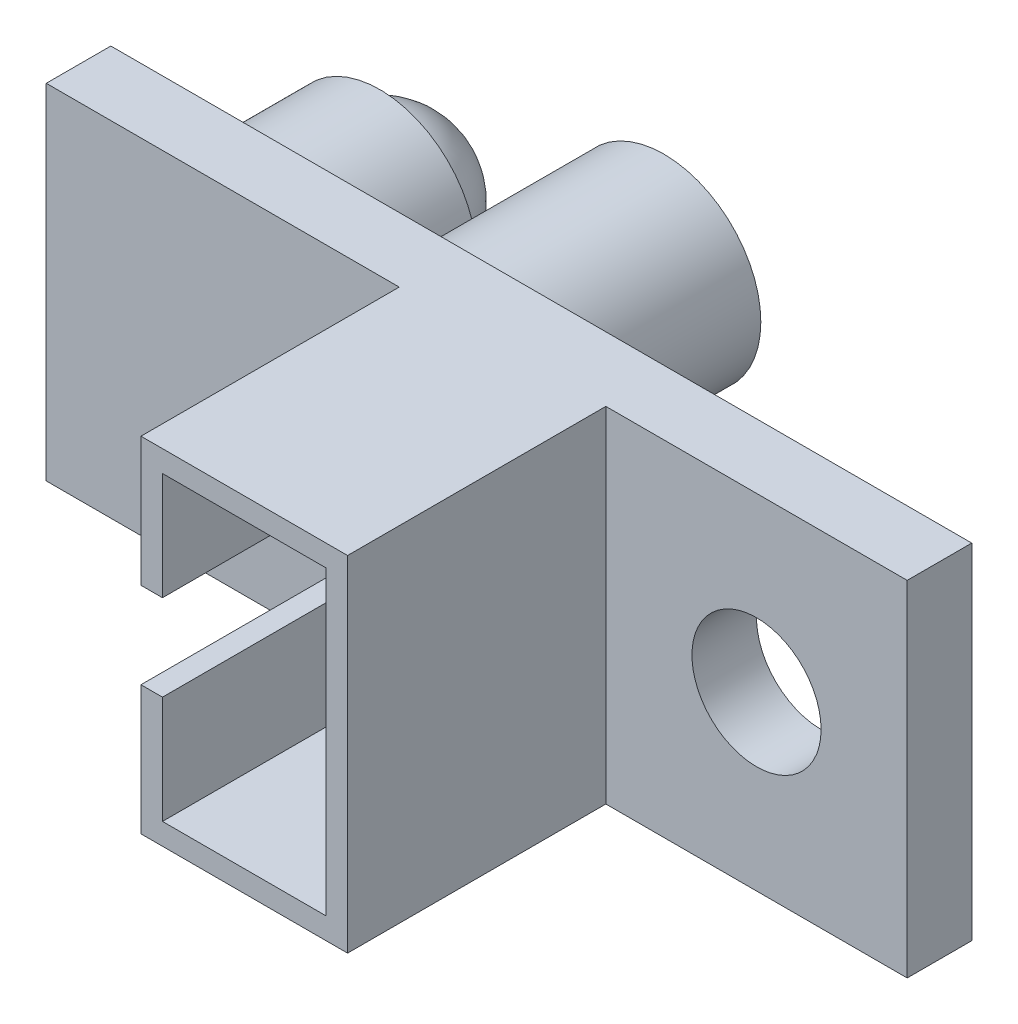
ISO-10303-21;
HEADER;
FILE_DESCRIPTION(('STEP AP214'),'2;1');
FILE_NAME('part.step','',(''),(''),'','','');
FILE_SCHEMA(('AUTOMOTIVE_DESIGN { 1 0 10303 214 1 1 1 1 }'));
ENDSEC;
DATA;
#1=APPLICATION_CONTEXT('core data for automotive mechanical design processes');
#2=APPLICATION_PROTOCOL_DEFINITION('international standard','automotive_design',2000,#1);
#3=PRODUCT_CONTEXT('',#1,'mechanical');
#4=PRODUCT('Part','Part','',(#3));
#5=PRODUCT_RELATED_PRODUCT_CATEGORY('part','',(#4));
#6=PRODUCT_DEFINITION_FORMATION('','',#4);
#7=PRODUCT_DEFINITION_CONTEXT('part definition',#1,'design');
#8=PRODUCT_DEFINITION('design','',#6,#7);
#9=PRODUCT_DEFINITION_SHAPE('','',#8);
#10=(LENGTH_UNIT() NAMED_UNIT(*) SI_UNIT(.MILLI.,.METRE.));
#11=(NAMED_UNIT(*) PLANE_ANGLE_UNIT() SI_UNIT($,.RADIAN.));
#12=(NAMED_UNIT(*) SI_UNIT($,.STERADIAN.) SOLID_ANGLE_UNIT());
#13=UNCERTAINTY_MEASURE_WITH_UNIT(LENGTH_MEASURE(1.E-05),#10,'distance_accuracy_value','');
#14=(GEOMETRIC_REPRESENTATION_CONTEXT(3) GLOBAL_UNCERTAINTY_ASSIGNED_CONTEXT((#13)) GLOBAL_UNIT_ASSIGNED_CONTEXT((#10,
#11,#12)) REPRESENTATION_CONTEXT('',''));
#15=CARTESIAN_POINT('',(0.,0.,0.));
#16=DIRECTION('',(0.,0.,1.));
#17=DIRECTION('',(1.,0.,0.));
#18=AXIS2_PLACEMENT_3D('',#15,#16,#17);
#19=CARTESIAN_POINT('',(-3.15,0.,-4.));
#20=DIRECTION('',(0.,0.,1.));
#21=DIRECTION('',(1.,0.,0.));
#22=AXIS2_PLACEMENT_3D('',#19,#20,#21);
#23=CYLINDRICAL_SURFACE('',#22,1.75);
#24=CARTESIAN_POINT('',(-3.15,0.,-6.));
#25=DIRECTION('',(0.,0.,-1.));
#26=DIRECTION('',(-1.,0.,0.));
#27=AXIS2_PLACEMENT_3D('',#24,#25,#26);
#28=CIRCLE('',#27,1.75);
#29=CARTESIAN_POINT('',(-4.9,0.,-6.));
#30=VERTEX_POINT('',#29);
#31=EDGE_CURVE('E344',#30,#30,#28,.T.);
#32=ORIENTED_EDGE('',*,*,#31,.T.);
#33=EDGE_LOOP('',(#32));
#34=FACE_BOUND('',#33,.T.);
#35=CARTESIAN_POINT('',(-3.15,0.,-4.));
#36=DIRECTION('',(0.,0.,1.));
#37=DIRECTION('',(1.,0.,0.));
#38=AXIS2_PLACEMENT_3D('',#35,#36,#37);
#39=CIRCLE('',#38,1.75);
#40=CARTESIAN_POINT('',(-1.4,0.,-4.));
#41=VERTEX_POINT('',#40);
#42=EDGE_CURVE('E12',#41,#41,#39,.F.);
#43=ORIENTED_EDGE('',*,*,#42,.F.);
#44=EDGE_LOOP('',(#43));
#45=FACE_BOUND('',#44,.T.);
#46=ADVANCED_FACE('F40',(#34,#45),#23,.F.);
#47=CARTESIAN_POINT('',(0.,0.,1.5));
#48=DIRECTION('',(0.,0.,1.));
#49=DIRECTION('',(1.,0.,0.));
#50=AXIS2_PLACEMENT_3D('',#47,#48,#49);
#51=PLANE('',#50);
#52=DIRECTION('',(0.,-1.,0.));
#53=VECTOR('',#52,1.);
#54=CARTESIAN_POINT('',(-1.8,4.,1.5));
#55=LINE('',#54,#53);
#56=CARTESIAN_POINT('',(-1.8,4.,1.5));
#57=VERTEX_POINT('',#56);
#58=CARTESIAN_POINT('',(-1.8,-4.,1.5));
#59=VERTEX_POINT('',#58);
#60=EDGE_CURVE('E233',#57,#59,#55,.T.);
#61=ORIENTED_EDGE('',*,*,#60,.F.);
#62=DIRECTION('',(-1.,0.,0.));
#63=VECTOR('',#62,1.);
#64=CARTESIAN_POINT('',(-10.,4.,1.5));
#65=LINE('',#64,#63);
#66=CARTESIAN_POINT('',(-10.,4.,1.5));
#67=VERTEX_POINT('',#66);
#68=EDGE_CURVE('E197',#57,#67,#65,.T.);
#69=ORIENTED_EDGE('',*,*,#68,.T.);
#70=DIRECTION('',(0.,-1.,0.));
#71=VECTOR('',#70,1.);
#72=CARTESIAN_POINT('',(-10.,4.,1.5));
#73=LINE('',#72,#71);
#74=CARTESIAN_POINT('',(-10.,-4.,1.5));
#75=VERTEX_POINT('',#74);
#76=EDGE_CURVE('E196',#67,#75,#73,.T.);
#77=ORIENTED_EDGE('',*,*,#76,.T.);
#78=DIRECTION('',(1.,0.,0.));
#79=VECTOR('',#78,1.);
#80=CARTESIAN_POINT('',(-10.,-4.,1.5));
#81=LINE('',#80,#79);
#82=EDGE_CURVE('E186',#75,#59,#81,.T.);
#83=ORIENTED_EDGE('',*,*,#82,.T.);
#84=EDGE_LOOP('',(#61,#69,#77,#83));
#85=FACE_BOUND('',#84,.T.);
#86=ADVANCED_FACE('F231',(#85),#51,.T.);
#87=CARTESIAN_POINT('',(10.,4.,1.5));
#88=DIRECTION('',(-1.,0.,0.));
#89=DIRECTION('',(0.,0.,1.));
#90=AXIS2_PLACEMENT_3D('',#87,#88,#89);
#91=PLANE('',#90);
#92=DIRECTION('',(0.,1.,0.));
#93=VECTOR('',#92,1.);
#94=CARTESIAN_POINT('',(10.,4.,0.));
#95=LINE('',#94,#93);
#96=CARTESIAN_POINT('',(10.,-4.,0.));
#97=VERTEX_POINT('',#96);
#98=CARTESIAN_POINT('',(10.,4.,0.));
#99=VERTEX_POINT('',#98);
#100=EDGE_CURVE('E176',#97,#99,#95,.T.);
#101=ORIENTED_EDGE('',*,*,#100,.T.);
#102=DIRECTION('',(0.,0.,-1.));
#103=VECTOR('',#102,1.);
#104=CARTESIAN_POINT('',(10.,4.,1.5));
#105=LINE('',#104,#103);
#106=CARTESIAN_POINT('',(10.,4.,1.5));
#107=VERTEX_POINT('',#106);
#108=EDGE_CURVE('E189',#107,#99,#105,.T.);
#109=ORIENTED_EDGE('',*,*,#108,.F.);
#110=DIRECTION('',(0.,1.,0.));
#111=VECTOR('',#110,1.);
#112=CARTESIAN_POINT('',(10.,4.,1.5));
#113=LINE('',#112,#111);
#114=CARTESIAN_POINT('',(10.,-4.,1.5));
#115=VERTEX_POINT('',#114);
#116=EDGE_CURVE('E181',#115,#107,#113,.T.);
#117=ORIENTED_EDGE('',*,*,#116,.F.);
#118=DIRECTION('',(0.,0.,-1.));
#119=VECTOR('',#118,1.);
#120=CARTESIAN_POINT('',(10.,-4.,1.5));
#121=LINE('',#120,#119);
#122=EDGE_CURVE('E182',#115,#97,#121,.T.);
#123=ORIENTED_EDGE('',*,*,#122,.T.);
#124=EDGE_LOOP('',(#101,#109,#117,#123));
#125=FACE_BOUND('',#124,.T.);
#126=ADVANCED_FACE('F229',(#125),#91,.F.);
#127=CARTESIAN_POINT('',(-10.,4.,1.5));
#128=DIRECTION('',(0.,-1.,0.));
#129=DIRECTION('',(0.,0.,-1.));
#130=AXIS2_PLACEMENT_3D('',#127,#128,#129);
#131=PLANE('',#130);
#132=DIRECTION('',(-1.,0.,0.));
#133=VECTOR('',#132,1.);
#134=CARTESIAN_POINT('',(-10.,4.,0.));
#135=LINE('',#134,#133);
#136=CARTESIAN_POINT('',(-10.,4.,0.));
#137=VERTEX_POINT('',#136);
#138=EDGE_CURVE('E175',#99,#137,#135,.T.);
#139=ORIENTED_EDGE('',*,*,#138,.T.);
#140=DIRECTION('',(0.,0.,-1.));
#141=VECTOR('',#140,1.);
#142=CARTESIAN_POINT('',(-10.,4.,1.5));
#143=LINE('',#142,#141);
#144=EDGE_CURVE('E165',#67,#137,#143,.T.);
#145=ORIENTED_EDGE('',*,*,#144,.F.);
#146=ORIENTED_EDGE('',*,*,#68,.F.);
#147=DIRECTION('',(0.,0.,-1.));
#148=VECTOR('',#147,1.);
#149=CARTESIAN_POINT('',(-1.8,4.,7.5));
#150=LINE('',#149,#148);
#151=CARTESIAN_POINT('',(-1.8,4.,7.5));
#152=VERTEX_POINT('',#151);
#153=EDGE_CURVE('E249',#152,#57,#150,.T.);
#154=ORIENTED_EDGE('',*,*,#153,.F.);
#155=DIRECTION('',(-1.,0.,0.));
#156=VECTOR('',#155,1.);
#157=CARTESIAN_POINT('',(-1.8,4.,7.5));
#158=LINE('',#157,#156);
#159=CARTESIAN_POINT('',(3.,4.,7.5));
#160=VERTEX_POINT('',#159);
#161=EDGE_CURVE('E264',#160,#152,#158,.T.);
#162=ORIENTED_EDGE('',*,*,#161,.F.);
#163=DIRECTION('',(0.,0.,-1.));
#164=VECTOR('',#163,1.);
#165=CARTESIAN_POINT('',(3.,4.,7.5));
#166=LINE('',#165,#164);
#167=CARTESIAN_POINT('',(3.,4.,1.5));
#168=VERTEX_POINT('',#167);
#169=EDGE_CURVE('E270',#160,#168,#166,.T.);
#170=ORIENTED_EDGE('',*,*,#169,.T.);
#171=EDGE_CURVE('E193',#107,#168,#65,.T.);
#172=ORIENTED_EDGE('',*,*,#171,.F.);
#173=ORIENTED_EDGE('',*,*,#108,.T.);
#174=EDGE_LOOP('',(#139,#145,#146,#154,#162,#170,#172,#173));
#175=FACE_BOUND('',#174,.T.);
#176=ADVANCED_FACE('F237',(#175),#131,.F.);
#177=CARTESIAN_POINT('',(-10.,4.,1.5));
#178=DIRECTION('',(1.,0.,0.));
#179=DIRECTION('',(0.,1.,0.));
#180=AXIS2_PLACEMENT_3D('',#177,#178,#179);
#181=PLANE('',#180);
#182=DIRECTION('',(0.,-1.,0.));
#183=VECTOR('',#182,1.);
#184=CARTESIAN_POINT('',(-10.,4.,0.));
#185=LINE('',#184,#183);
#186=CARTESIAN_POINT('',(-10.,0.,0.));
#187=VERTEX_POINT('',#186);
#188=EDGE_CURVE('E157',#137,#187,#185,.T.);
#189=ORIENTED_EDGE('',*,*,#188,.T.);
#190=CARTESIAN_POINT('',(-10.,-4.,0.));
#191=VERTEX_POINT('',#190);
#192=EDGE_CURVE('E161',#187,#191,#185,.T.);
#193=ORIENTED_EDGE('',*,*,#192,.T.);
#194=DIRECTION('',(0.,0.,-1.));
#195=VECTOR('',#194,1.);
#196=CARTESIAN_POINT('',(-10.,-4.,1.5));
#197=LINE('',#196,#195);
#198=EDGE_CURVE('E185',#75,#191,#197,.T.);
#199=ORIENTED_EDGE('',*,*,#198,.F.);
#200=ORIENTED_EDGE('',*,*,#76,.F.);
#201=ORIENTED_EDGE('',*,*,#144,.T.);
#202=EDGE_LOOP('',(#189,#193,#199,#200,#201));
#203=FACE_BOUND('',#202,.T.);
#204=ADVANCED_FACE('F159',(#203),#181,.F.);
#205=CARTESIAN_POINT('',(-10.,-4.,1.5));
#206=DIRECTION('',(0.,1.,0.));
#207=DIRECTION('',(0.,0.,1.));
#208=AXIS2_PLACEMENT_3D('',#205,#206,#207);
#209=PLANE('',#208);
#210=DIRECTION('',(1.,0.,0.));
#211=VECTOR('',#210,1.);
#212=CARTESIAN_POINT('',(-10.,-4.,0.));
#213=LINE('',#212,#211);
#214=EDGE_CURVE('E168',#191,#97,#213,.T.);
#215=ORIENTED_EDGE('',*,*,#214,.T.);
#216=ORIENTED_EDGE('',*,*,#122,.F.);
#217=CARTESIAN_POINT('',(3.,-4.,1.5));
#218=VERTEX_POINT('',#217);
#219=EDGE_CURVE('E205',#218,#115,#81,.T.);
#220=ORIENTED_EDGE('',*,*,#219,.F.);
#221=DIRECTION('',(0.,0.,-1.));
#222=VECTOR('',#221,1.);
#223=CARTESIAN_POINT('',(3.,-4.,7.5));
#224=LINE('',#223,#222);
#225=CARTESIAN_POINT('',(3.,-4.,7.5));
#226=VERTEX_POINT('',#225);
#227=EDGE_CURVE('E245',#226,#218,#224,.T.);
#228=ORIENTED_EDGE('',*,*,#227,.F.);
#229=DIRECTION('',(1.,0.,0.));
#230=VECTOR('',#229,1.);
#231=CARTESIAN_POINT('',(-1.8,-4.,7.5));
#232=LINE('',#231,#230);
#233=CARTESIAN_POINT('',(-1.8,-4.,7.5));
#234=VERTEX_POINT('',#233);
#235=EDGE_CURVE('E241',#234,#226,#232,.T.);
#236=ORIENTED_EDGE('',*,*,#235,.F.);
#237=DIRECTION('',(0.,0.,-1.));
#238=VECTOR('',#237,1.);
#239=CARTESIAN_POINT('',(-1.8,-4.,7.5));
#240=LINE('',#239,#238);
#241=EDGE_CURVE('E240',#234,#59,#240,.T.);
#242=ORIENTED_EDGE('',*,*,#241,.T.);
#243=ORIENTED_EDGE('',*,*,#82,.F.);
#244=ORIENTED_EDGE('',*,*,#198,.T.);
#245=EDGE_LOOP('',(#215,#216,#220,#228,#236,#242,#243,#244));
#246=FACE_BOUND('',#245,.T.);
#247=ADVANCED_FACE('F226',(#246),#209,.F.);
#248=DIRECTION('',(0.,1.,0.));
#249=VECTOR('',#248,1.);
#250=CARTESIAN_POINT('',(3.,4.,1.5));
#251=LINE('',#250,#249);
#252=EDGE_CURVE('E222',#218,#168,#251,.T.);
#253=ORIENTED_EDGE('',*,*,#252,.F.);
#254=ORIENTED_EDGE('',*,*,#219,.T.);
#255=ORIENTED_EDGE('',*,*,#116,.T.);
#256=ORIENTED_EDGE('',*,*,#171,.T.);
#257=EDGE_LOOP('',(#253,#254,#255,#256));
#258=FACE_BOUND('',#257,.T.);
#259=CARTESIAN_POINT('',(6.5,0.,1.5));
#260=DIRECTION('',(0.,0.,1.));
#261=DIRECTION('',(1.,0.,0.));
#262=AXIS2_PLACEMENT_3D('',#259,#260,#261);
#263=CIRCLE('',#262,1.5);
#264=CARTESIAN_POINT('',(8.,0.,1.5));
#265=VERTEX_POINT('',#264);
#266=EDGE_CURVE('E244',#265,#265,#263,.T.);
#267=ORIENTED_EDGE('',*,*,#266,.F.);
#268=EDGE_LOOP('',(#267));
#269=FACE_BOUND('',#268,.T.);
#270=ADVANCED_FACE('F217',(#258,#269),#51,.T.);
#271=CARTESIAN_POINT('',(0.,0.,0.));
#272=DIRECTION('',(0.,0.,1.));
#273=DIRECTION('',(1.,0.,0.));
#274=AXIS2_PLACEMENT_3D('',#271,#272,#273);
#275=PLANE('',#274);
#276=CARTESIAN_POINT('',(-3.15,0.,0.));
#277=DIRECTION('',(0.,0.,1.));
#278=DIRECTION('',(1.,0.,0.));
#279=AXIS2_PLACEMENT_3D('',#276,#277,#278);
#280=CIRCLE('',#279,2.25);
#281=CARTESIAN_POINT('',(-0.899999999999999,0.,0.));
#282=VERTEX_POINT('',#281);
#283=EDGE_CURVE('E48',#282,#282,#280,.F.);
#284=ORIENTED_EDGE('',*,*,#283,.F.);
#285=EDGE_LOOP('',(#284));
#286=FACE_BOUND('',#285,.T.);
#287=CARTESIAN_POINT('',(6.5,0.,0.));
#288=DIRECTION('',(0.,0.,1.));
#289=DIRECTION('',(1.,0.,0.));
#290=AXIS2_PLACEMENT_3D('',#287,#288,#289);
#291=CIRCLE('',#290,1.5);
#292=CARTESIAN_POINT('',(8.,0.,0.));
#293=VERTEX_POINT('',#292);
#294=EDGE_CURVE('E268',#293,#293,#291,.T.);
#295=ORIENTED_EDGE('',*,*,#294,.T.);
#296=EDGE_LOOP('',(#295));
#297=FACE_BOUND('',#296,.T.);
#298=ORIENTED_EDGE('',*,*,#192,.F.);
#299=CARTESIAN_POINT('',(-7.75,0.,0.));
#300=DIRECTION('',(0.,0.,-1.));
#301=DIRECTION('',(-1.,0.,0.));
#302=AXIS2_PLACEMENT_3D('',#299,#300,#301);
#303=CIRCLE('',#302,2.25);
#304=EDGE_CURVE('E173',#187,#187,#303,.T.);
#305=ORIENTED_EDGE('',*,*,#304,.F.);
#306=ORIENTED_EDGE('',*,*,#188,.F.);
#307=ORIENTED_EDGE('',*,*,#138,.F.);
#308=ORIENTED_EDGE('',*,*,#100,.F.);
#309=ORIENTED_EDGE('',*,*,#214,.F.);
#310=EDGE_LOOP('',(#298,#305,#306,#307,#308,#309));
#311=FACE_BOUND('',#310,.T.);
#312=ADVANCED_FACE('F171',(#286,#297,#311),#275,.F.);
#313=CARTESIAN_POINT('',(6.5,0.,0.));
#314=DIRECTION('',(0.,0.,1.));
#315=DIRECTION('',(1.,0.,0.));
#316=AXIS2_PLACEMENT_3D('',#313,#314,#315);
#317=CYLINDRICAL_SURFACE('',#316,1.5);
#318=ORIENTED_EDGE('',*,*,#294,.F.);
#319=EDGE_LOOP('',(#318));
#320=FACE_BOUND('',#319,.T.);
#321=ORIENTED_EDGE('',*,*,#266,.T.);
#322=EDGE_LOOP('',(#321));
#323=FACE_BOUND('',#322,.T.);
#324=ADVANCED_FACE('F412',(#320,#323),#317,.F.);
#325=CARTESIAN_POINT('',(0.,0.,7.5));
#326=DIRECTION('',(0.,0.,1.));
#327=DIRECTION('',(1.,0.,0.));
#328=AXIS2_PLACEMENT_3D('',#325,#326,#327);
#329=PLANE('',#328);
#330=DIRECTION('',(-1.,0.,0.));
#331=VECTOR('',#330,1.);
#332=CARTESIAN_POINT('',(-0.799999999999999,-1.,7.5));
#333=LINE('',#332,#331);
#334=CARTESIAN_POINT('',(-1.3,-1.,7.5));
#335=VERTEX_POINT('',#334);
#336=CARTESIAN_POINT('',(-1.8,-1.,7.5));
#337=VERTEX_POINT('',#336);
#338=EDGE_CURVE('E307',#335,#337,#333,.T.);
#339=ORIENTED_EDGE('',*,*,#338,.T.);
#340=DIRECTION('',(0.,-1.,0.));
#341=VECTOR('',#340,1.);
#342=CARTESIAN_POINT('',(-1.8,4.,7.5));
#343=LINE('',#342,#341);
#344=EDGE_CURVE('E252',#337,#234,#343,.T.);
#345=ORIENTED_EDGE('',*,*,#344,.T.);
#346=ORIENTED_EDGE('',*,*,#235,.T.);
#347=DIRECTION('',(0.,1.,0.));
#348=VECTOR('',#347,1.);
#349=CARTESIAN_POINT('',(3.,4.,7.5));
#350=LINE('',#349,#348);
#351=EDGE_CURVE('E281',#226,#160,#350,.T.);
#352=ORIENTED_EDGE('',*,*,#351,.T.);
#353=ORIENTED_EDGE('',*,*,#161,.T.);
#354=CARTESIAN_POINT('',(-1.8,1.,7.5));
#355=VERTEX_POINT('',#354);
#356=EDGE_CURVE('E284',#152,#355,#343,.T.);
#357=ORIENTED_EDGE('',*,*,#356,.T.);
#358=DIRECTION('',(-1.,0.,0.));
#359=VECTOR('',#358,1.);
#360=CARTESIAN_POINT('',(-0.799999999999999,1.,7.5));
#361=LINE('',#360,#359);
#362=CARTESIAN_POINT('',(-1.3,1.,7.5));
#363=VERTEX_POINT('',#362);
#364=EDGE_CURVE('E317',#363,#355,#361,.T.);
#365=ORIENTED_EDGE('',*,*,#364,.F.);
#366=DIRECTION('',(0.,-1.,0.));
#367=VECTOR('',#366,1.);
#368=CARTESIAN_POINT('',(-1.3,3.5,7.5));
#369=LINE('',#368,#367);
#370=CARTESIAN_POINT('',(-1.3,3.5,7.5));
#371=VERTEX_POINT('',#370);
#372=EDGE_CURVE('E314',#371,#363,#369,.T.);
#373=ORIENTED_EDGE('',*,*,#372,.F.);
#374=DIRECTION('',(-1.,0.,0.));
#375=VECTOR('',#374,1.);
#376=CARTESIAN_POINT('',(-1.3,3.5,7.5));
#377=LINE('',#376,#375);
#378=CARTESIAN_POINT('',(2.5,3.5,7.5));
#379=VERTEX_POINT('',#378);
#380=EDGE_CURVE('E293',#379,#371,#377,.T.);
#381=ORIENTED_EDGE('',*,*,#380,.F.);
#382=DIRECTION('',(0.,1.,0.));
#383=VECTOR('',#382,1.);
#384=CARTESIAN_POINT('',(2.5,3.5,7.5));
#385=LINE('',#384,#383);
#386=CARTESIAN_POINT('',(2.5,-3.5,7.5));
#387=VERTEX_POINT('',#386);
#388=EDGE_CURVE('E309',#387,#379,#385,.T.);
#389=ORIENTED_EDGE('',*,*,#388,.F.);
#390=DIRECTION('',(1.,0.,0.));
#391=VECTOR('',#390,1.);
#392=CARTESIAN_POINT('',(-1.3,-3.5,7.5));
#393=LINE('',#392,#391);
#394=CARTESIAN_POINT('',(-1.3,-3.5,7.5));
#395=VERTEX_POINT('',#394);
#396=EDGE_CURVE('E312',#395,#387,#393,.T.);
#397=ORIENTED_EDGE('',*,*,#396,.F.);
#398=EDGE_CURVE('E297',#335,#395,#369,.T.);
#399=ORIENTED_EDGE('',*,*,#398,.F.);
#400=EDGE_LOOP('',(#339,#345,#346,#352,#353,#357,#365,#373,#381,#389,#397,#399));
#401=FACE_BOUND('',#400,.T.);
#402=ADVANCED_FACE('F409',(#401),#329,.T.);
#403=CARTESIAN_POINT('',(-1.8,4.,7.5));
#404=DIRECTION('',(1.,0.,0.));
#405=DIRECTION('',(0.,1.,0.));
#406=AXIS2_PLACEMENT_3D('',#403,#404,#405);
#407=PLANE('',#406);
#408=ORIENTED_EDGE('',*,*,#344,.F.);
#409=DIRECTION('',(0.,0.,1.));
#410=VECTOR('',#409,1.);
#411=CARTESIAN_POINT('',(-1.8,-1.,3.));
#412=LINE('',#411,#410);
#413=CARTESIAN_POINT('',(-1.8,-1.,3.));
#414=VERTEX_POINT('',#413);
#415=EDGE_CURVE('E319',#414,#337,#412,.T.);
#416=ORIENTED_EDGE('',*,*,#415,.F.);
#417=DIRECTION('',(0.,-1.,0.));
#418=VECTOR('',#417,1.);
#419=CARTESIAN_POINT('',(-1.8,1.,3.));
#420=LINE('',#419,#418);
#421=CARTESIAN_POINT('',(-1.8,1.,3.));
#422=VERTEX_POINT('',#421);
#423=EDGE_CURVE('E326',#422,#414,#420,.T.);
#424=ORIENTED_EDGE('',*,*,#423,.F.);
#425=DIRECTION('',(0.,0.,-1.));
#426=VECTOR('',#425,1.);
#427=CARTESIAN_POINT('',(-1.8,1.,3.));
#428=LINE('',#427,#426);
#429=EDGE_CURVE('E329',#355,#422,#428,.T.);
#430=ORIENTED_EDGE('',*,*,#429,.F.);
#431=ORIENTED_EDGE('',*,*,#356,.F.);
#432=ORIENTED_EDGE('',*,*,#153,.T.);
#433=ORIENTED_EDGE('',*,*,#60,.T.);
#434=ORIENTED_EDGE('',*,*,#241,.F.);
#435=EDGE_LOOP('',(#408,#416,#424,#430,#431,#432,#433,#434));
#436=FACE_BOUND('',#435,.T.);
#437=ADVANCED_FACE('F247',(#436),#407,.F.);
#438=CARTESIAN_POINT('',(3.,4.,7.5));
#439=DIRECTION('',(-1.,0.,0.));
#440=DIRECTION('',(0.,-1.,0.));
#441=AXIS2_PLACEMENT_3D('',#438,#439,#440);
#442=PLANE('',#441);
#443=ORIENTED_EDGE('',*,*,#252,.T.);
#444=ORIENTED_EDGE('',*,*,#169,.F.);
#445=ORIENTED_EDGE('',*,*,#351,.F.);
#446=ORIENTED_EDGE('',*,*,#227,.T.);
#447=EDGE_LOOP('',(#443,#444,#445,#446));
#448=FACE_BOUND('',#447,.T.);
#449=ADVANCED_FACE('F279',(#448),#442,.F.);
#450=CARTESIAN_POINT('',(-1.3,3.5,7.5));
#451=DIRECTION('',(1.,0.,0.));
#452=DIRECTION('',(0.,1.,0.));
#453=AXIS2_PLACEMENT_3D('',#450,#451,#452);
#454=PLANE('',#453);
#455=DIRECTION('',(0.,0.,-1.));
#456=VECTOR('',#455,1.);
#457=CARTESIAN_POINT('',(-1.3,-1.,7.5));
#458=LINE('',#457,#456);
#459=CARTESIAN_POINT('',(-1.3,-1.,3.));
#460=VERTEX_POINT('',#459);
#461=EDGE_CURVE('E622',#335,#460,#458,.T.);
#462=ORIENTED_EDGE('',*,*,#461,.F.);
#463=ORIENTED_EDGE('',*,*,#398,.T.);
#464=DIRECTION('',(0.,0.,-1.));
#465=VECTOR('',#464,1.);
#466=CARTESIAN_POINT('',(-1.3,-3.5,7.5));
#467=LINE('',#466,#465);
#468=CARTESIAN_POINT('',(-1.3,-3.5,1.5));
#469=VERTEX_POINT('',#468);
#470=EDGE_CURVE('E250',#395,#469,#467,.T.);
#471=ORIENTED_EDGE('',*,*,#470,.T.);
#472=DIRECTION('',(0.,-1.,0.));
#473=VECTOR('',#472,1.);
#474=CARTESIAN_POINT('',(-1.3,3.5,1.5));
#475=LINE('',#474,#473);
#476=CARTESIAN_POINT('',(-1.3,3.5,1.5));
#477=VERTEX_POINT('',#476);
#478=EDGE_CURVE('E304',#477,#469,#475,.T.);
#479=ORIENTED_EDGE('',*,*,#478,.F.);
#480=DIRECTION('',(0.,0.,-1.));
#481=VECTOR('',#480,1.);
#482=CARTESIAN_POINT('',(-1.3,3.5,7.5));
#483=LINE('',#482,#481);
#484=EDGE_CURVE('E63',#371,#477,#483,.T.);
#485=ORIENTED_EDGE('',*,*,#484,.F.);
#486=ORIENTED_EDGE('',*,*,#372,.T.);
#487=DIRECTION('',(0.,0.,1.));
#488=VECTOR('',#487,1.);
#489=CARTESIAN_POINT('',(-1.3,1.,7.5));
#490=LINE('',#489,#488);
#491=CARTESIAN_POINT('',(-1.3,1.,3.));
#492=VERTEX_POINT('',#491);
#493=EDGE_CURVE('E192',#492,#363,#490,.T.);
#494=ORIENTED_EDGE('',*,*,#493,.F.);
#495=DIRECTION('',(0.,1.,0.));
#496=VECTOR('',#495,1.);
#497=CARTESIAN_POINT('',(-1.3,3.5,3.));
#498=LINE('',#497,#496);
#499=EDGE_CURVE('E623',#460,#492,#498,.T.);
#500=ORIENTED_EDGE('',*,*,#499,.F.);
#501=EDGE_LOOP('',(#462,#463,#471,#479,#485,#486,#494,#500));
#502=FACE_BOUND('',#501,.T.);
#503=ADVANCED_FACE('F404',(#502),#454,.T.);
#504=CARTESIAN_POINT('',(-1.3,-3.5,7.5));
#505=DIRECTION('',(0.,1.,0.));
#506=DIRECTION('',(-1.,0.,0.));
#507=AXIS2_PLACEMENT_3D('',#504,#505,#506);
#508=PLANE('',#507);
#509=DIRECTION('',(1.,0.,0.));
#510=VECTOR('',#509,1.);
#511=CARTESIAN_POINT('',(-1.3,-3.5,1.5));
#512=LINE('',#511,#510);
#513=CARTESIAN_POINT('',(2.5,-3.5,1.5));
#514=VERTEX_POINT('',#513);
#515=EDGE_CURVE('E301',#469,#514,#512,.T.);
#516=ORIENTED_EDGE('',*,*,#515,.F.);
#517=ORIENTED_EDGE('',*,*,#470,.F.);
#518=ORIENTED_EDGE('',*,*,#396,.T.);
#519=DIRECTION('',(0.,0.,-1.));
#520=VECTOR('',#519,1.);
#521=CARTESIAN_POINT('',(2.5,-3.5,7.5));
#522=LINE('',#521,#520);
#523=EDGE_CURVE('E254',#387,#514,#522,.T.);
#524=ORIENTED_EDGE('',*,*,#523,.T.);
#525=EDGE_LOOP('',(#516,#517,#518,#524));
#526=FACE_BOUND('',#525,.T.);
#527=ADVANCED_FACE('F400',(#526),#508,.T.);
#528=CARTESIAN_POINT('',(2.5,3.5,7.5));
#529=DIRECTION('',(-1.,0.,0.));
#530=DIRECTION('',(0.,0.,1.));
#531=AXIS2_PLACEMENT_3D('',#528,#529,#530);
#532=PLANE('',#531);
#533=DIRECTION('',(0.,1.,0.));
#534=VECTOR('',#533,1.);
#535=CARTESIAN_POINT('',(2.5,3.5,1.5));
#536=LINE('',#535,#534);
#537=CARTESIAN_POINT('',(2.5,3.5,1.5));
#538=VERTEX_POINT('',#537);
#539=EDGE_CURVE('E298',#514,#538,#536,.T.);
#540=ORIENTED_EDGE('',*,*,#539,.F.);
#541=ORIENTED_EDGE('',*,*,#523,.F.);
#542=ORIENTED_EDGE('',*,*,#388,.T.);
#543=DIRECTION('',(0.,0.,-1.));
#544=VECTOR('',#543,1.);
#545=CARTESIAN_POINT('',(2.5,3.5,7.5));
#546=LINE('',#545,#544);
#547=EDGE_CURVE('E290',#379,#538,#546,.T.);
#548=ORIENTED_EDGE('',*,*,#547,.T.);
#549=EDGE_LOOP('',(#540,#541,#542,#548));
#550=FACE_BOUND('',#549,.T.);
#551=ADVANCED_FACE('F397',(#550),#532,.T.);
#552=CARTESIAN_POINT('',(-1.3,3.5,7.5));
#553=DIRECTION('',(0.,-1.,0.));
#554=DIRECTION('',(0.,0.,-1.));
#555=AXIS2_PLACEMENT_3D('',#552,#553,#554);
#556=PLANE('',#555);
#557=DIRECTION('',(-1.,0.,0.));
#558=VECTOR('',#557,1.);
#559=CARTESIAN_POINT('',(-1.3,3.5,1.5));
#560=LINE('',#559,#558);
#561=EDGE_CURVE('E294',#538,#477,#560,.T.);
#562=ORIENTED_EDGE('',*,*,#561,.F.);
#563=ORIENTED_EDGE('',*,*,#547,.F.);
#564=ORIENTED_EDGE('',*,*,#380,.T.);
#565=ORIENTED_EDGE('',*,*,#484,.T.);
#566=EDGE_LOOP('',(#562,#563,#564,#565));
#567=FACE_BOUND('',#566,.T.);
#568=ADVANCED_FACE('F394',(#567),#556,.T.);
#569=ORIENTED_EDGE('',*,*,#561,.T.);
#570=ORIENTED_EDGE('',*,*,#478,.T.);
#571=ORIENTED_EDGE('',*,*,#515,.T.);
#572=ORIENTED_EDGE('',*,*,#539,.T.);
#573=EDGE_LOOP('',(#569,#570,#571,#572));
#574=FACE_BOUND('',#573,.T.);
#575=ADVANCED_FACE('F369',(#574),#51,.T.);
#576=CARTESIAN_POINT('',(-0.799999999999999,-1.,3.));
#577=DIRECTION('',(0.,-1.,0.));
#578=DIRECTION('',(1.,0.,0.));
#579=AXIS2_PLACEMENT_3D('',#576,#577,#578);
#580=PLANE('',#579);
#581=ORIENTED_EDGE('',*,*,#461,.T.);
#582=DIRECTION('',(-1.,0.,0.));
#583=VECTOR('',#582,1.);
#584=CARTESIAN_POINT('',(-0.799999999999999,-1.,3.));
#585=LINE('',#584,#583);
#586=EDGE_CURVE('E321',#460,#414,#585,.T.);
#587=ORIENTED_EDGE('',*,*,#586,.T.);
#588=ORIENTED_EDGE('',*,*,#415,.T.);
#589=ORIENTED_EDGE('',*,*,#338,.F.);
#590=EDGE_LOOP('',(#581,#587,#588,#589));
#591=FACE_BOUND('',#590,.T.);
#592=ADVANCED_FACE('F384',(#591),#580,.F.);
#593=CARTESIAN_POINT('',(-0.799999999999999,1.,3.));
#594=DIRECTION('',(0.,0.,-1.));
#595=DIRECTION('',(-1.,0.,0.));
#596=AXIS2_PLACEMENT_3D('',#593,#594,#595);
#597=PLANE('',#596);
#598=ORIENTED_EDGE('',*,*,#499,.T.);
#599=DIRECTION('',(-1.,0.,0.));
#600=VECTOR('',#599,1.);
#601=CARTESIAN_POINT('',(-0.799999999999999,1.,3.));
#602=LINE('',#601,#600);
#603=EDGE_CURVE('E55',#492,#422,#602,.T.);
#604=ORIENTED_EDGE('',*,*,#603,.T.);
#605=ORIENTED_EDGE('',*,*,#423,.T.);
#606=ORIENTED_EDGE('',*,*,#586,.F.);
#607=EDGE_LOOP('',(#598,#604,#605,#606));
#608=FACE_BOUND('',#607,.T.);
#609=ADVANCED_FACE('F387',(#608),#597,.F.);
#610=CARTESIAN_POINT('',(-0.799999999999999,1.,3.));
#611=DIRECTION('',(0.,1.,0.));
#612=DIRECTION('',(-1.,0.,0.));
#613=AXIS2_PLACEMENT_3D('',#610,#611,#612);
#614=PLANE('',#613);
#615=ORIENTED_EDGE('',*,*,#493,.T.);
#616=ORIENTED_EDGE('',*,*,#364,.T.);
#617=ORIENTED_EDGE('',*,*,#429,.T.);
#618=ORIENTED_EDGE('',*,*,#603,.F.);
#619=EDGE_LOOP('',(#615,#616,#617,#618));
#620=FACE_BOUND('',#619,.T.);
#621=ADVANCED_FACE('F379',(#620),#614,.F.);
#622=CARTESIAN_POINT('',(-7.75,0.,-4.));
#623=DIRECTION('',(0.,0.,-1.));
#624=DIRECTION('',(-1.,0.,0.));
#625=AXIS2_PLACEMENT_3D('',#622,#623,#624);
#626=PLANE('',#625);
#627=CARTESIAN_POINT('',(-7.75,0.,-4.));
#628=DIRECTION('',(0.,0.,-1.));
#629=DIRECTION('',(-1.,0.,0.));
#630=AXIS2_PLACEMENT_3D('',#627,#628,#629);
#631=CIRCLE('',#630,2.25);
#632=CARTESIAN_POINT('',(-10.,0.,-4.));
#633=VERTEX_POINT('',#632);
#634=EDGE_CURVE('E331',#633,#633,#631,.T.);
#635=ORIENTED_EDGE('',*,*,#634,.T.);
#636=EDGE_LOOP('',(#635));
#637=FACE_BOUND('',#636,.T.);
#638=CARTESIAN_POINT('',(-7.75,0.,-4.));
#639=DIRECTION('',(0.,0.,-1.));
#640=DIRECTION('',(-1.,0.,0.));
#641=AXIS2_PLACEMENT_3D('',#638,#639,#640);
#642=CIRCLE('',#641,1.75);
#643=CARTESIAN_POINT('',(-9.5,0.,-4.));
#644=VERTEX_POINT('',#643);
#645=EDGE_CURVE('E333',#644,#644,#642,.T.);
#646=ORIENTED_EDGE('',*,*,#645,.F.);
#647=EDGE_LOOP('',(#646));
#648=FACE_BOUND('',#647,.T.);
#649=ADVANCED_FACE('F376',(#637,#648),#626,.T.);
#650=CARTESIAN_POINT('',(-7.75,0.,-4.));
#651=DIRECTION('',(0.,0.,1.));
#652=DIRECTION('',(1.,0.,0.));
#653=AXIS2_PLACEMENT_3D('',#650,#651,#652);
#654=CYLINDRICAL_SURFACE('',#653,2.25);
#655=ORIENTED_EDGE('',*,*,#634,.F.);
#656=EDGE_LOOP('',(#655));
#657=FACE_BOUND('',#656,.T.);
#658=ORIENTED_EDGE('',*,*,#304,.T.);
#659=EDGE_LOOP('',(#658));
#660=FACE_BOUND('',#659,.T.);
#661=ADVANCED_FACE('F374',(#657,#660),#654,.T.);
#662=CARTESIAN_POINT('',(-7.75,0.,-4.));
#663=DIRECTION('',(0.,0.,1.));
#664=DIRECTION('',(1.,0.,0.));
#665=AXIS2_PLACEMENT_3D('',#662,#663,#664);
#666=CYLINDRICAL_SURFACE('',#665,1.75);
#667=ORIENTED_EDGE('',*,*,#645,.T.);
#668=EDGE_LOOP('',(#667));
#669=FACE_BOUND('',#668,.T.);
#670=CARTESIAN_POINT('',(-7.75,0.,0.));
#671=DIRECTION('',(0.,0.,-1.));
#672=DIRECTION('',(-1.,0.,0.));
#673=AXIS2_PLACEMENT_3D('',#670,#671,#672);
#674=CIRCLE('',#673,1.75);
#675=CARTESIAN_POINT('',(-9.5,0.,0.));
#676=VERTEX_POINT('',#675);
#677=EDGE_CURVE('E336',#676,#676,#674,.T.);
#678=ORIENTED_EDGE('',*,*,#677,.F.);
#679=EDGE_LOOP('',(#678));
#680=FACE_BOUND('',#679,.T.);
#681=ADVANCED_FACE('F371',(#669,#680),#666,.F.);
#682=ORIENTED_EDGE('',*,*,#677,.T.);
#683=EDGE_LOOP('',(#682));
#684=FACE_BOUND('',#683,.T.);
#685=ADVANCED_FACE('F360',(#684),#275,.F.);
#686=CARTESIAN_POINT('',(-3.15,0.,-4.));
#687=DIRECTION('',(0.,0.,1.));
#688=DIRECTION('',(1.,0.,0.));
#689=AXIS2_PLACEMENT_3D('',#686,#687,#688);
#690=CYLINDRICAL_SURFACE('',#689,2.25);
#691=ORIENTED_EDGE('',*,*,#283,.T.);
#692=EDGE_LOOP('',(#691));
#693=FACE_BOUND('',#692,.T.);
#694=CARTESIAN_POINT('',(-3.15,0.,-6.));
#695=DIRECTION('',(0.,0.,-1.));
#696=DIRECTION('',(-1.,0.,0.));
#697=AXIS2_PLACEMENT_3D('',#694,#695,#696);
#698=CIRCLE('',#697,2.25);
#699=CARTESIAN_POINT('',(-5.4,0.,-6.));
#700=VERTEX_POINT('',#699);
#701=EDGE_CURVE('E339',#700,#700,#698,.T.);
#702=ORIENTED_EDGE('',*,*,#701,.F.);
#703=EDGE_LOOP('',(#702));
#704=FACE_BOUND('',#703,.T.);
#705=ADVANCED_FACE('F352',(#693,#704),#690,.T.);
#706=CARTESIAN_POINT('',(-3.15,0.,-6.));
#707=DIRECTION('',(0.,0.,-1.));
#708=DIRECTION('',(-1.,0.,0.));
#709=AXIS2_PLACEMENT_3D('',#706,#707,#708);
#710=PLANE('',#709);
#711=ORIENTED_EDGE('',*,*,#701,.T.);
#712=EDGE_LOOP('',(#711));
#713=FACE_BOUND('',#712,.T.);
#714=ORIENTED_EDGE('',*,*,#31,.F.);
#715=EDGE_LOOP('',(#714));
#716=FACE_BOUND('',#715,.T.);
#717=ADVANCED_FACE('F350',(#713,#716),#710,.T.);
#718=CARTESIAN_POINT('',(-3.15,0.,-4.));
#719=DIRECTION('',(0.,1.,0.));
#720=DIRECTION('',(-1.,0.,0.));
#721=AXIS2_PLACEMENT_3D('',#718,#719,#720);
#722=SPHERICAL_SURFACE('',#721,1.75);
#723=CARTESIAN_POINT('',(-3.15,0.,-4.));
#724=DIRECTION('',(0.,0.,1.));
#725=DIRECTION('',(1.,0.,0.));
#726=AXIS2_PLACEMENT_3D('',#723,#724,#725);
#727=SPHERICAL_SURFACE('',#726,1.75);
#728=ORIENTED_EDGE('',*,*,#42,.T.);
#729=EDGE_LOOP('',(#728));
#730=FACE_BOUND('',#729,.T.);
#731=ADVANCED_FACE('F42',(#730),#727,.T.);
#732=CLOSED_SHELL('',(#46,#86,#126,#176,#204,#247,#270,#312,#324,#402,#437,#449,#503,#527,#551,
#568,#575,#592,#609,#621,#649,#661,#681,#685,#705,#717,#731));
#733=MANIFOLD_SOLID_BREP('B2',#732);
#734=CARTESIAN_POINT('',(-7.75,0.,-4.));
#735=DIRECTION('',(0.,1.,0.));
#736=DIRECTION('',(-1.,0.,0.));
#737=AXIS2_PLACEMENT_3D('',#734,#735,#736);
#738=SPHERICAL_SURFACE('',#737,1.75);
#739=CARTESIAN_POINT('',(-7.75,1.75,-4.));
#740=VERTEX_POINT('',#739);
#741=VERTEX_LOOP('',#740);
#742=FACE_BOUND('',#741,.T.);
#743=ADVANCED_FACE('F645',(#742),#738,.T.);
#744=CLOSED_SHELL('',(#743));
#745=MANIFOLD_SOLID_BREP('B6',#744);
#746=ADVANCED_BREP_SHAPE_REPRESENTATION('',(#18,#733,#745),#14);
#747=SHAPE_DEFINITION_REPRESENTATION(#9,#746);
ENDSEC;
END-ISO-10303-21;
